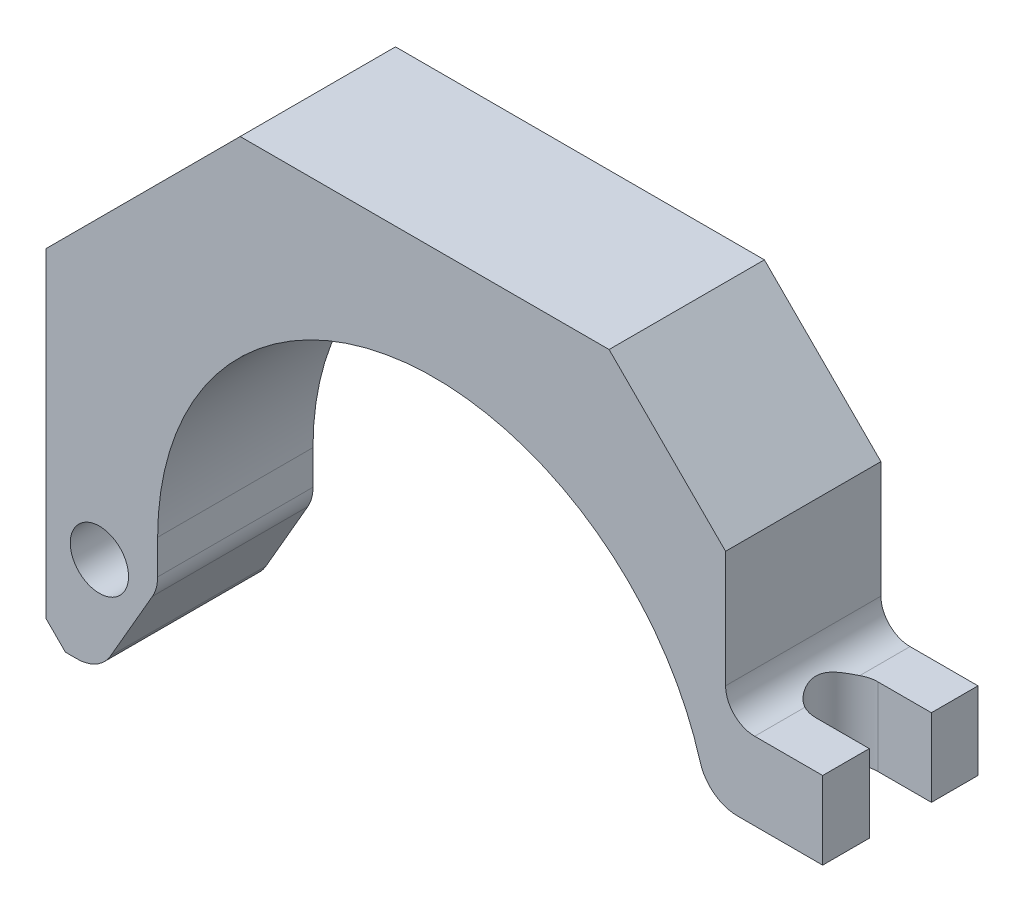
ISO-10303-21;
HEADER;
FILE_DESCRIPTION(('STEP AP214'),'2;1');
FILE_NAME('part.step','',(''),(''),'','','');
FILE_SCHEMA(('AUTOMOTIVE_DESIGN { 1 0 10303 214 1 1 1 1 }'));
ENDSEC;
DATA;
#1=APPLICATION_CONTEXT('core data for automotive mechanical design processes');
#2=APPLICATION_PROTOCOL_DEFINITION('international standard','automotive_design',2000,#1);
#3=PRODUCT_CONTEXT('',#1,'mechanical');
#4=PRODUCT('Part','Part','',(#3));
#5=PRODUCT_RELATED_PRODUCT_CATEGORY('part','',(#4));
#6=PRODUCT_DEFINITION_FORMATION('','',#4);
#7=PRODUCT_DEFINITION_CONTEXT('part definition',#1,'design');
#8=PRODUCT_DEFINITION('design','',#6,#7);
#9=PRODUCT_DEFINITION_SHAPE('','',#8);
#10=(LENGTH_UNIT() NAMED_UNIT(*) SI_UNIT(.MILLI.,.METRE.));
#11=(NAMED_UNIT(*) PLANE_ANGLE_UNIT() SI_UNIT($,.RADIAN.));
#12=(NAMED_UNIT(*) SI_UNIT($,.STERADIAN.) SOLID_ANGLE_UNIT());
#13=UNCERTAINTY_MEASURE_WITH_UNIT(LENGTH_MEASURE(1.E-05),#10,'distance_accuracy_value','');
#14=(GEOMETRIC_REPRESENTATION_CONTEXT(3) GLOBAL_UNCERTAINTY_ASSIGNED_CONTEXT((#13)) GLOBAL_UNIT_ASSIGNED_CONTEXT((#10,
#11,#12)) REPRESENTATION_CONTEXT('',''));
#15=CARTESIAN_POINT('',(0.,0.,0.));
#16=DIRECTION('',(0.,0.,1.));
#17=DIRECTION('',(1.,0.,0.));
#18=AXIS2_PLACEMENT_3D('',#15,#16,#17);
#19=CARTESIAN_POINT('',(40.,20.,16.));
#20=DIRECTION('',(-1.,0.,0.));
#21=DIRECTION('',(0.,0.,1.));
#22=AXIS2_PLACEMENT_3D('',#19,#20,#21);
#23=PLANE('',#22);
#24=DIRECTION('',(0.,0.,-1.));
#25=VECTOR('',#24,1.);
#26=CARTESIAN_POINT('',(40.,-15.,16.));
#27=LINE('',#26,#25);
#28=CARTESIAN_POINT('',(40.,-15.,16.));
#29=VERTEX_POINT('',#28);
#30=CARTESIAN_POINT('',(40.,-15.,11.2));
#31=VERTEX_POINT('',#30);
#32=EDGE_CURVE('E236',#29,#31,#27,.T.);
#33=ORIENTED_EDGE('',*,*,#32,.T.);
#34=DIRECTION('',(0.,1.,0.));
#35=VECTOR('',#34,1.);
#36=CARTESIAN_POINT('',(40.,20.,11.2));
#37=LINE('',#36,#35);
#38=CARTESIAN_POINT('',(40.,-7.,11.2));
#39=VERTEX_POINT('',#38);
#40=EDGE_CURVE('E216',#31,#39,#37,.T.);
#41=ORIENTED_EDGE('',*,*,#40,.T.);
#42=DIRECTION('',(0.,0.,1.));
#43=VECTOR('',#42,1.);
#44=CARTESIAN_POINT('',(40.,-7.,16.));
#45=LINE('',#44,#43);
#46=CARTESIAN_POINT('',(40.,-7.,16.));
#47=VERTEX_POINT('',#46);
#48=EDGE_CURVE('E292',#39,#47,#45,.T.);
#49=ORIENTED_EDGE('',*,*,#48,.T.);
#50=DIRECTION('',(0.,1.,0.));
#51=VECTOR('',#50,1.);
#52=CARTESIAN_POINT('',(40.,20.,16.));
#53=LINE('',#52,#51);
#54=EDGE_CURVE('E246',#29,#47,#53,.T.);
#55=ORIENTED_EDGE('',*,*,#54,.F.);
#56=EDGE_LOOP('',(#33,#41,#49,#55));
#57=FACE_BOUND('',#56,.T.);
#58=ADVANCED_FACE('F36',(#57),#23,.F.);
#59=CARTESIAN_POINT('',(30.,-7.,0.));
#60=DIRECTION('',(0.,-1.,0.));
#61=DIRECTION('',(0.,0.,-1.));
#62=AXIS2_PLACEMENT_3D('',#59,#60,#61);
#63=PLANE('',#62);
#64=DIRECTION('',(-1.,0.,0.));
#65=VECTOR('',#64,1.);
#66=CARTESIAN_POINT('',(30.,-7.,11.2));
#67=LINE('',#66,#65);
#68=CARTESIAN_POINT('',(34.5,-7.,11.2));
#69=VERTEX_POINT('',#68);
#70=EDGE_CURVE('E11',#39,#69,#67,.T.);
#71=ORIENTED_EDGE('',*,*,#70,.T.);
#72=CARTESIAN_POINT('',(34.5,-7.,8.));
#73=DIRECTION('',(0.,-1.,0.));
#74=DIRECTION('',(0.,0.,-1.));
#75=AXIS2_PLACEMENT_3D('',#72,#73,#74);
#76=CIRCLE('',#75,3.2);
#77=CARTESIAN_POINT('',(33.,-7.,10.8266588050205));
#78=VERTEX_POINT('',#77);
#79=EDGE_CURVE('E213',#69,#78,#76,.T.);
#80=ORIENTED_EDGE('',*,*,#79,.T.);
#81=DIRECTION('',(0.,0.,1.));
#82=VECTOR('',#81,1.);
#83=CARTESIAN_POINT('',(33.,-7.,16.));
#84=LINE('',#83,#82);
#85=CARTESIAN_POINT('',(33.,-7.,16.));
#86=VERTEX_POINT('',#85);
#87=EDGE_CURVE('E305',#78,#86,#84,.T.);
#88=ORIENTED_EDGE('',*,*,#87,.T.);
#89=DIRECTION('',(1.,0.,0.));
#90=VECTOR('',#89,1.);
#91=CARTESIAN_POINT('',(30.,-7.,16.));
#92=LINE('',#91,#90);
#93=EDGE_CURVE('E224',#86,#47,#92,.T.);
#94=ORIENTED_EDGE('',*,*,#93,.T.);
#95=ORIENTED_EDGE('',*,*,#48,.F.);
#96=EDGE_LOOP('',(#71,#80,#88,#94,#95));
#97=FACE_BOUND('',#96,.T.);
#98=ADVANCED_FACE('F374',(#97),#63,.F.);
#99=CARTESIAN_POINT('',(0.,-20.,16.));
#100=DIRECTION('',(0.,0.,1.));
#101=DIRECTION('',(1.,0.,0.));
#102=AXIS2_PLACEMENT_3D('',#99,#100,#101);
#103=PLANE('',#102);
#104=DIRECTION('',(0.,-1.,0.));
#105=VECTOR('',#104,1.);
#106=CARTESIAN_POINT('',(-40.,20.,16.));
#107=LINE('',#106,#105);
#108=CARTESIAN_POINT('',(-40.,0.,16.));
#109=VERTEX_POINT('',#108);
#110=CARTESIAN_POINT('',(-40.,-33.,16.));
#111=VERTEX_POINT('',#110);
#112=EDGE_CURVE('E252',#109,#111,#107,.T.);
#113=ORIENTED_EDGE('',*,*,#112,.T.);
#114=DIRECTION('',(-0.707106781186548,0.707106781186548,0.));
#115=VECTOR('',#114,1.);
#116=CARTESIAN_POINT('',(-26.5,-46.5,16.));
#117=LINE('',#116,#115);
#118=CARTESIAN_POINT('',(-38.,-35.,16.));
#119=VERTEX_POINT('',#118);
#120=EDGE_CURVE('E350',#111,#119,#117,.F.);
#121=ORIENTED_EDGE('',*,*,#120,.T.);
#122=DIRECTION('',(1.,0.,0.));
#123=VECTOR('',#122,1.);
#124=CARTESIAN_POINT('',(-40.,-35.,16.));
#125=LINE('',#124,#123);
#126=CARTESIAN_POINT('',(-36.8094010767585,-35.,16.));
#127=VERTEX_POINT('',#126);
#128=EDGE_CURVE('E254',#119,#127,#125,.T.);
#129=ORIENTED_EDGE('',*,*,#128,.T.);
#130=CARTESIAN_POINT('',(-36.8094010767585,-31.,16.));
#131=DIRECTION('',(0.,0.,1.));
#132=DIRECTION('',(1.,0.,0.));
#133=AXIS2_PLACEMENT_3D('',#130,#131,#132);
#134=CIRCLE('',#133,4.);
#135=CARTESIAN_POINT('',(-33.3452994616207,-33.,16.));
#136=VERTEX_POINT('',#135);
#137=EDGE_CURVE('E328',#127,#136,#134,.T.);
#138=ORIENTED_EDGE('',*,*,#137,.T.);
#139=DIRECTION('',(-0.500000000000001,-0.866025403784438,0.));
#140=VECTOR('',#139,1.);
#141=CARTESIAN_POINT('',(-19.3798094716167,-8.81106178471843,16.));
#142=LINE('',#141,#140);
#143=CARTESIAN_POINT('',(-29.0358983848623,-25.5358983848623,16.));
#144=VERTEX_POINT('',#143);
#145=EDGE_CURVE('E279',#136,#144,#142,.F.);
#146=ORIENTED_EDGE('',*,*,#145,.T.);
#147=CARTESIAN_POINT('',(-32.5,-23.5358983848623,16.));
#148=DIRECTION('',(0.,0.,1.));
#149=DIRECTION('',(1.,0.,0.));
#150=AXIS2_PLACEMENT_3D('',#147,#148,#149);
#151=CIRCLE('',#150,4.);
#152=CARTESIAN_POINT('',(-28.5,-23.5358983848623,16.));
#153=VERTEX_POINT('',#152);
#154=EDGE_CURVE('E323',#144,#153,#151,.T.);
#155=ORIENTED_EDGE('',*,*,#154,.T.);
#156=DIRECTION('',(0.,1.,0.));
#157=VECTOR('',#156,1.);
#158=CARTESIAN_POINT('',(-28.5,-35.,16.));
#159=LINE('',#158,#157);
#160=CARTESIAN_POINT('',(-28.5,-20.,16.));
#161=VERTEX_POINT('',#160);
#162=EDGE_CURVE('E256',#153,#161,#159,.T.);
#163=ORIENTED_EDGE('',*,*,#162,.T.);
#164=CARTESIAN_POINT('',(0.,-20.,16.));
#165=DIRECTION('',(0.,0.,-1.));
#166=DIRECTION('',(1.,0.,0.));
#167=AXIS2_PLACEMENT_3D('',#164,#165,#166);
#168=CIRCLE('',#167,28.5);
#169=CARTESIAN_POINT('',(27.3854245775,-12.1076923076923,16.));
#170=VERTEX_POINT('',#169);
#171=EDGE_CURVE('E258',#161,#170,#168,.T.);
#172=ORIENTED_EDGE('',*,*,#171,.T.);
#173=CARTESIAN_POINT('',(31.2289929392544,-11.,16.));
#174=DIRECTION('',(0.,0.,1.));
#175=DIRECTION('',(1.,0.,0.));
#176=AXIS2_PLACEMENT_3D('',#173,#174,#175);
#177=CIRCLE('',#176,4.);
#178=CARTESIAN_POINT('',(31.2289929392544,-15.,16.));
#179=VERTEX_POINT('',#178);
#180=EDGE_CURVE('E338',#170,#179,#177,.T.);
#181=ORIENTED_EDGE('',*,*,#180,.T.);
#182=DIRECTION('',(-1.,0.,0.));
#183=VECTOR('',#182,1.);
#184=CARTESIAN_POINT('',(-17.5120876663421,-15.,16.));
#185=LINE('',#184,#183);
#186=EDGE_CURVE('E226',#29,#179,#185,.T.);
#187=ORIENTED_EDGE('',*,*,#186,.F.);
#188=ORIENTED_EDGE('',*,*,#54,.T.);
#189=ORIENTED_EDGE('',*,*,#93,.F.);
#190=CARTESIAN_POINT('',(33.,-4.,16.));
#191=DIRECTION('',(0.,0.,1.));
#192=DIRECTION('',(1.,0.,0.));
#193=AXIS2_PLACEMENT_3D('',#190,#191,#192);
#194=CIRCLE('',#193,3.);
#195=CARTESIAN_POINT('',(30.,-4.,16.));
#196=VERTEX_POINT('',#195);
#197=EDGE_CURVE('E311',#86,#196,#194,.F.);
#198=ORIENTED_EDGE('',*,*,#197,.T.);
#199=DIRECTION('',(0.,-1.,0.));
#200=VECTOR('',#199,1.);
#201=CARTESIAN_POINT('',(30.,22.6403912651916,16.));
#202=LINE('',#201,#200);
#203=CARTESIAN_POINT('',(30.,7.99999999999994,16.));
#204=VERTEX_POINT('',#203);
#205=EDGE_CURVE('E219',#204,#196,#202,.T.);
#206=ORIENTED_EDGE('',*,*,#205,.F.);
#207=DIRECTION('',(0.707106781186546,-0.707106781186549,0.));
#208=VECTOR('',#207,1.);
#209=CARTESIAN_POINT('',(29.,8.9999999999999,16.));
#210=LINE('',#209,#208);
#211=CARTESIAN_POINT('',(18.,20.,16.));
#212=VERTEX_POINT('',#211);
#213=EDGE_CURVE('E303',#204,#212,#210,.F.);
#214=ORIENTED_EDGE('',*,*,#213,.T.);
#215=DIRECTION('',(-1.,0.,0.));
#216=VECTOR('',#215,1.);
#217=CARTESIAN_POINT('',(-40.,20.,16.));
#218=LINE('',#217,#216);
#219=CARTESIAN_POINT('',(-19.9999999999999,20.,16.));
#220=VERTEX_POINT('',#219);
#221=EDGE_CURVE('E249',#212,#220,#218,.T.);
#222=ORIENTED_EDGE('',*,*,#221,.T.);
#223=DIRECTION('',(0.707106781186548,0.707106781186547,0.));
#224=VECTOR('',#223,1.);
#225=CARTESIAN_POINT('',(-30.,10.,16.));
#226=LINE('',#225,#224);
#227=EDGE_CURVE('E290',#220,#109,#226,.F.);
#228=ORIENTED_EDGE('',*,*,#227,.T.);
#229=EDGE_LOOP('',(#113,#121,#129,#138,#146,#155,#163,#172,#181,#187,#188,#189,#198,#206,#214,
#222,#228));
#230=FACE_BOUND('',#229,.T.);
#231=CARTESIAN_POINT('',(-34.5,-25.,16.));
#232=DIRECTION('',(0.,0.,1.));
#233=DIRECTION('',(1.,0.,0.));
#234=AXIS2_PLACEMENT_3D('',#231,#232,#233);
#235=CIRCLE('',#234,3.);
#236=CARTESIAN_POINT('',(-31.5,-25.,16.));
#237=VERTEX_POINT('',#236);
#238=EDGE_CURVE('E240',#237,#237,#235,.T.);
#239=ORIENTED_EDGE('',*,*,#238,.F.);
#240=EDGE_LOOP('',(#239));
#241=FACE_BOUND('',#240,.T.);
#242=ADVANCED_FACE('F387',(#230,#241),#103,.T.);
#243=CARTESIAN_POINT('',(0.,-20.,0.));
#244=DIRECTION('',(0.,0.,1.));
#245=DIRECTION('',(1.,0.,0.));
#246=AXIS2_PLACEMENT_3D('',#243,#244,#245);
#247=PLANE('',#246);
#248=DIRECTION('',(1.,0.,0.));
#249=VECTOR('',#248,1.);
#250=CARTESIAN_POINT('',(-40.,-35.,0.));
#251=LINE('',#250,#249);
#252=CARTESIAN_POINT('',(-38.,-35.,0.));
#253=VERTEX_POINT('',#252);
#254=CARTESIAN_POINT('',(-36.8094010767585,-35.,0.));
#255=VERTEX_POINT('',#254);
#256=EDGE_CURVE('E268',#253,#255,#251,.T.);
#257=ORIENTED_EDGE('',*,*,#256,.F.);
#258=DIRECTION('',(0.707106781186548,-0.707106781186548,0.));
#259=VECTOR('',#258,1.);
#260=CARTESIAN_POINT('',(-38.,-35.,0.));
#261=LINE('',#260,#259);
#262=CARTESIAN_POINT('',(-40.,-33.,0.));
#263=VERTEX_POINT('',#262);
#264=EDGE_CURVE('E347',#253,#263,#261,.F.);
#265=ORIENTED_EDGE('',*,*,#264,.T.);
#266=DIRECTION('',(0.,-1.,0.));
#267=VECTOR('',#266,1.);
#268=CARTESIAN_POINT('',(-40.,-20.,0.));
#269=LINE('',#268,#267);
#270=CARTESIAN_POINT('',(-40.,0.,0.));
#271=VERTEX_POINT('',#270);
#272=EDGE_CURVE('E266',#271,#263,#269,.T.);
#273=ORIENTED_EDGE('',*,*,#272,.F.);
#274=DIRECTION('',(-0.707106781186548,-0.707106781186547,0.));
#275=VECTOR('',#274,1.);
#276=CARTESIAN_POINT('',(-40.,0.,0.));
#277=LINE('',#276,#275);
#278=CARTESIAN_POINT('',(-19.9999999999999,20.,0.));
#279=VERTEX_POINT('',#278);
#280=EDGE_CURVE('E284',#271,#279,#277,.F.);
#281=ORIENTED_EDGE('',*,*,#280,.T.);
#282=DIRECTION('',(-1.,0.,0.));
#283=VECTOR('',#282,1.);
#284=CARTESIAN_POINT('',(-40.,20.,0.));
#285=LINE('',#284,#283);
#286=CARTESIAN_POINT('',(18.,20.,0.));
#287=VERTEX_POINT('',#286);
#288=EDGE_CURVE('E264',#287,#279,#285,.T.);
#289=ORIENTED_EDGE('',*,*,#288,.F.);
#290=DIRECTION('',(-0.707106781186546,0.707106781186549,0.));
#291=VECTOR('',#290,1.);
#292=CARTESIAN_POINT('',(18.,20.,0.));
#293=LINE('',#292,#291);
#294=CARTESIAN_POINT('',(30.,7.99999999999995,0.));
#295=VERTEX_POINT('',#294);
#296=EDGE_CURVE('E299',#287,#295,#293,.F.);
#297=ORIENTED_EDGE('',*,*,#296,.T.);
#298=DIRECTION('',(0.,-1.,0.));
#299=VECTOR('',#298,1.);
#300=CARTESIAN_POINT('',(30.,22.6403912651916,0.));
#301=LINE('',#300,#299);
#302=CARTESIAN_POINT('',(30.,-4.,0.));
#303=VERTEX_POINT('',#302);
#304=EDGE_CURVE('E220',#295,#303,#301,.T.);
#305=ORIENTED_EDGE('',*,*,#304,.T.);
#306=CARTESIAN_POINT('',(33.,-4.,0.));
#307=DIRECTION('',(0.,0.,1.));
#308=DIRECTION('',(1.,0.,0.));
#309=AXIS2_PLACEMENT_3D('',#306,#307,#308);
#310=CIRCLE('',#309,3.);
#311=CARTESIAN_POINT('',(33.,-7.,0.));
#312=VERTEX_POINT('',#311);
#313=EDGE_CURVE('E313',#303,#312,#310,.T.);
#314=ORIENTED_EDGE('',*,*,#313,.T.);
#315=DIRECTION('',(1.,0.,0.));
#316=VECTOR('',#315,1.);
#317=CARTESIAN_POINT('',(30.,-7.,0.));
#318=LINE('',#317,#316);
#319=CARTESIAN_POINT('',(40.,-7.,0.));
#320=VERTEX_POINT('',#319);
#321=EDGE_CURVE('E223',#312,#320,#318,.T.);
#322=ORIENTED_EDGE('',*,*,#321,.T.);
#323=DIRECTION('',(0.,1.,0.));
#324=VECTOR('',#323,1.);
#325=CARTESIAN_POINT('',(40.,20.,0.));
#326=LINE('',#325,#324);
#327=CARTESIAN_POINT('',(40.,-15.,0.));
#328=VERTEX_POINT('',#327);
#329=EDGE_CURVE('E243',#328,#320,#326,.T.);
#330=ORIENTED_EDGE('',*,*,#329,.F.);
#331=DIRECTION('',(-1.,0.,0.));
#332=VECTOR('',#331,1.);
#333=CARTESIAN_POINT('',(-17.5120876663421,-15.,0.));
#334=LINE('',#333,#332);
#335=CARTESIAN_POINT('',(31.2289929392544,-15.,0.));
#336=VERTEX_POINT('',#335);
#337=EDGE_CURVE('E231',#328,#336,#334,.T.);
#338=ORIENTED_EDGE('',*,*,#337,.T.);
#339=CARTESIAN_POINT('',(31.2289929392544,-11.,0.));
#340=DIRECTION('',(0.,0.,1.));
#341=DIRECTION('',(1.,0.,0.));
#342=AXIS2_PLACEMENT_3D('',#339,#340,#341);
#343=CIRCLE('',#342,4.);
#344=CARTESIAN_POINT('',(27.3854245775,-12.1076923076923,0.));
#345=VERTEX_POINT('',#344);
#346=EDGE_CURVE('E342',#336,#345,#343,.F.);
#347=ORIENTED_EDGE('',*,*,#346,.T.);
#348=CARTESIAN_POINT('',(0.,-20.,0.));
#349=DIRECTION('',(0.,0.,-1.));
#350=DIRECTION('',(1.,0.,0.));
#351=AXIS2_PLACEMENT_3D('',#348,#349,#350);
#352=CIRCLE('',#351,28.5);
#353=CARTESIAN_POINT('',(-28.5,-20.,0.));
#354=VERTEX_POINT('',#353);
#355=EDGE_CURVE('E250',#354,#345,#352,.T.);
#356=ORIENTED_EDGE('',*,*,#355,.F.);
#357=DIRECTION('',(0.,1.,0.));
#358=VECTOR('',#357,1.);
#359=CARTESIAN_POINT('',(-28.5,-35.,0.));
#360=LINE('',#359,#358);
#361=CARTESIAN_POINT('',(-28.5,-23.5358983848623,0.));
#362=VERTEX_POINT('',#361);
#363=EDGE_CURVE('E270',#362,#354,#360,.T.);
#364=ORIENTED_EDGE('',*,*,#363,.F.);
#365=CARTESIAN_POINT('',(-32.5,-23.5358983848623,0.));
#366=DIRECTION('',(0.,0.,1.));
#367=DIRECTION('',(1.,0.,0.));
#368=AXIS2_PLACEMENT_3D('',#365,#366,#367);
#369=CIRCLE('',#368,4.);
#370=CARTESIAN_POINT('',(-29.0358983848623,-25.5358983848623,0.));
#371=VERTEX_POINT('',#370);
#372=EDGE_CURVE('E318',#362,#371,#369,.F.);
#373=ORIENTED_EDGE('',*,*,#372,.T.);
#374=DIRECTION('',(0.500000000000001,0.866025403784438,0.));
#375=VECTOR('',#374,1.);
#376=CARTESIAN_POINT('',(-28.5,-24.6076951545868,0.));
#377=LINE('',#376,#375);
#378=CARTESIAN_POINT('',(-33.3452994616207,-33.,0.));
#379=VERTEX_POINT('',#378);
#380=EDGE_CURVE('E276',#371,#379,#377,.F.);
#381=ORIENTED_EDGE('',*,*,#380,.T.);
#382=CARTESIAN_POINT('',(-36.8094010767585,-31.,0.));
#383=DIRECTION('',(0.,0.,1.));
#384=DIRECTION('',(1.,0.,0.));
#385=AXIS2_PLACEMENT_3D('',#382,#383,#384);
#386=CIRCLE('',#385,4.);
#387=EDGE_CURVE('E332',#379,#255,#386,.F.);
#388=ORIENTED_EDGE('',*,*,#387,.T.);
#389=EDGE_LOOP('',(#257,#265,#273,#281,#289,#297,#305,#314,#322,#330,#338,#347,#356,#364,#373,
#381,#388));
#390=FACE_BOUND('',#389,.T.);
#391=CARTESIAN_POINT('',(-34.5,-25.,0.));
#392=DIRECTION('',(0.,0.,1.));
#393=DIRECTION('',(1.,0.,0.));
#394=AXIS2_PLACEMENT_3D('',#391,#392,#393);
#395=CIRCLE('',#394,3.);
#396=CARTESIAN_POINT('',(-31.5,-25.,0.));
#397=VERTEX_POINT('',#396);
#398=EDGE_CURVE('E239',#397,#397,#395,.T.);
#399=ORIENTED_EDGE('',*,*,#398,.T.);
#400=EDGE_LOOP('',(#399));
#401=FACE_BOUND('',#400,.T.);
#402=ADVANCED_FACE('F390',(#390,#401),#247,.F.);
#403=CARTESIAN_POINT('',(40.,-7.,4.8));
#404=VERTEX_POINT('',#403);
#405=EDGE_CURVE('E293',#320,#404,#45,.T.);
#406=ORIENTED_EDGE('',*,*,#405,.T.);
#407=DIRECTION('',(0.,-1.,0.));
#408=VECTOR('',#407,1.);
#409=CARTESIAN_POINT('',(40.,20.,4.8));
#410=LINE('',#409,#408);
#411=CARTESIAN_POINT('',(40.,-15.,4.8));
#412=VERTEX_POINT('',#411);
#413=EDGE_CURVE('E214',#404,#412,#410,.T.);
#414=ORIENTED_EDGE('',*,*,#413,.T.);
#415=EDGE_CURVE('E207',#412,#328,#27,.T.);
#416=ORIENTED_EDGE('',*,*,#415,.T.);
#417=ORIENTED_EDGE('',*,*,#329,.T.);
#418=EDGE_LOOP('',(#406,#414,#416,#417));
#419=FACE_BOUND('',#418,.T.);
#420=ADVANCED_FACE('F394',(#419),#23,.F.);
#421=CARTESIAN_POINT('',(-40.,20.,16.));
#422=DIRECTION('',(0.,-1.,0.));
#423=DIRECTION('',(0.,0.,-1.));
#424=AXIS2_PLACEMENT_3D('',#421,#422,#423);
#425=PLANE('',#424);
#426=ORIENTED_EDGE('',*,*,#221,.F.);
#427=DIRECTION('',(0.,0.,-1.));
#428=VECTOR('',#427,1.);
#429=CARTESIAN_POINT('',(18.,20.,16.));
#430=LINE('',#429,#428);
#431=EDGE_CURVE('E296',#212,#287,#430,.T.);
#432=ORIENTED_EDGE('',*,*,#431,.T.);
#433=ORIENTED_EDGE('',*,*,#288,.T.);
#434=DIRECTION('',(0.,0.,1.));
#435=VECTOR('',#434,1.);
#436=CARTESIAN_POINT('',(-19.9999999999999,20.,16.));
#437=LINE('',#436,#435);
#438=EDGE_CURVE('E287',#279,#220,#437,.T.);
#439=ORIENTED_EDGE('',*,*,#438,.T.);
#440=EDGE_LOOP('',(#426,#432,#433,#439));
#441=FACE_BOUND('',#440,.T.);
#442=ADVANCED_FACE('F410',(#441),#425,.F.);
#443=CARTESIAN_POINT('',(-40.,-20.,16.));
#444=DIRECTION('',(1.,0.,0.));
#445=DIRECTION('',(0.,0.,-1.));
#446=AXIS2_PLACEMENT_3D('',#443,#444,#445);
#447=PLANE('',#446);
#448=ORIENTED_EDGE('',*,*,#272,.T.);
#449=DIRECTION('',(0.,0.,1.));
#450=VECTOR('',#449,1.);
#451=CARTESIAN_POINT('',(-40.,-33.,16.));
#452=LINE('',#451,#450);
#453=EDGE_CURVE('E59',#263,#111,#452,.T.);
#454=ORIENTED_EDGE('',*,*,#453,.T.);
#455=ORIENTED_EDGE('',*,*,#112,.F.);
#456=DIRECTION('',(0.,0.,-1.));
#457=VECTOR('',#456,1.);
#458=CARTESIAN_POINT('',(-40.,0.,16.));
#459=LINE('',#458,#457);
#460=EDGE_CURVE('E281',#109,#271,#459,.T.);
#461=ORIENTED_EDGE('',*,*,#460,.T.);
#462=EDGE_LOOP('',(#448,#454,#455,#461));
#463=FACE_BOUND('',#462,.T.);
#464=ADVANCED_FACE('F406',(#463),#447,.F.);
#465=CARTESIAN_POINT('',(-40.,-35.,16.));
#466=DIRECTION('',(0.,1.,0.));
#467=DIRECTION('',(0.,0.,1.));
#468=AXIS2_PLACEMENT_3D('',#465,#466,#467);
#469=PLANE('',#468);
#470=ORIENTED_EDGE('',*,*,#128,.F.);
#471=DIRECTION('',(0.,0.,-1.));
#472=VECTOR('',#471,1.);
#473=CARTESIAN_POINT('',(-38.,-35.,16.));
#474=LINE('',#473,#472);
#475=EDGE_CURVE('E344',#119,#253,#474,.T.);
#476=ORIENTED_EDGE('',*,*,#475,.T.);
#477=ORIENTED_EDGE('',*,*,#256,.T.);
#478=DIRECTION('',(0.,0.,-1.));
#479=VECTOR('',#478,1.);
#480=CARTESIAN_POINT('',(-36.8094010767585,-35.,16.));
#481=LINE('',#480,#479);
#482=EDGE_CURVE('E325',#255,#127,#481,.F.);
#483=ORIENTED_EDGE('',*,*,#482,.T.);
#484=EDGE_LOOP('',(#470,#476,#477,#483));
#485=FACE_BOUND('',#484,.T.);
#486=ADVANCED_FACE('F402',(#485),#469,.F.);
#487=CARTESIAN_POINT('',(-28.5,-35.,16.));
#488=DIRECTION('',(-1.,0.,0.));
#489=DIRECTION('',(0.,-1.,0.));
#490=AXIS2_PLACEMENT_3D('',#487,#488,#489);
#491=PLANE('',#490);
#492=ORIENTED_EDGE('',*,*,#162,.F.);
#493=DIRECTION('',(0.,0.,1.));
#494=VECTOR('',#493,1.);
#495=CARTESIAN_POINT('',(-28.5,-23.5358983848623,0.));
#496=LINE('',#495,#494);
#497=EDGE_CURVE('E315',#153,#362,#496,.F.);
#498=ORIENTED_EDGE('',*,*,#497,.T.);
#499=ORIENTED_EDGE('',*,*,#363,.T.);
#500=DIRECTION('',(0.,0.,-1.));
#501=VECTOR('',#500,1.);
#502=CARTESIAN_POINT('',(-28.5,-20.,16.));
#503=LINE('',#502,#501);
#504=EDGE_CURVE('E261',#161,#354,#503,.T.);
#505=ORIENTED_EDGE('',*,*,#504,.F.);
#506=EDGE_LOOP('',(#492,#498,#499,#505));
#507=FACE_BOUND('',#506,.T.);
#508=ADVANCED_FACE('F398',(#507),#491,.F.);
#509=CARTESIAN_POINT('',(0.,-20.,16.));
#510=DIRECTION('',(0.,0.,-1.));
#511=DIRECTION('',(-1.,0.,0.));
#512=AXIS2_PLACEMENT_3D('',#509,#510,#511);
#513=CYLINDRICAL_SURFACE('',#512,28.5);
#514=ORIENTED_EDGE('',*,*,#355,.T.);
#515=DIRECTION('',(0.,0.,-1.));
#516=VECTOR('',#515,1.);
#517=CARTESIAN_POINT('',(27.3854245775,-12.1076923076923,16.));
#518=LINE('',#517,#516);
#519=EDGE_CURVE('E335',#345,#170,#518,.F.);
#520=ORIENTED_EDGE('',*,*,#519,.T.);
#521=ORIENTED_EDGE('',*,*,#171,.F.);
#522=ORIENTED_EDGE('',*,*,#504,.T.);
#523=EDGE_LOOP('',(#514,#520,#521,#522));
#524=FACE_BOUND('',#523,.T.);
#525=ADVANCED_FACE('F385',(#524),#513,.F.);
#526=CARTESIAN_POINT('',(-34.5,-25.,16.));
#527=DIRECTION('',(0.,0.,-1.));
#528=DIRECTION('',(-1.,0.,0.));
#529=AXIS2_PLACEMENT_3D('',#526,#527,#528);
#530=CYLINDRICAL_SURFACE('',#529,3.);
#531=ORIENTED_EDGE('',*,*,#238,.T.);
#532=EDGE_LOOP('',(#531));
#533=FACE_BOUND('',#532,.T.);
#534=ORIENTED_EDGE('',*,*,#398,.F.);
#535=EDGE_LOOP('',(#534));
#536=FACE_BOUND('',#535,.T.);
#537=ADVANCED_FACE('F382',(#533,#536),#530,.F.);
#538=CARTESIAN_POINT('',(-28.5,-24.6076951545868,16.));
#539=DIRECTION('',(-0.866025403784438,0.500000000000001,0.));
#540=DIRECTION('',(0.,0.,-1.));
#541=AXIS2_PLACEMENT_3D('',#538,#539,#540);
#542=PLANE('',#541);
#543=ORIENTED_EDGE('',*,*,#145,.F.);
#544=DIRECTION('',(0.,0.,1.));
#545=VECTOR('',#544,1.);
#546=CARTESIAN_POINT('',(-33.3452994616207,-33.,0.));
#547=LINE('',#546,#545);
#548=EDGE_CURVE('E330',#136,#379,#547,.F.);
#549=ORIENTED_EDGE('',*,*,#548,.T.);
#550=ORIENTED_EDGE('',*,*,#380,.F.);
#551=DIRECTION('',(0.,0.,-1.));
#552=VECTOR('',#551,1.);
#553=CARTESIAN_POINT('',(-29.0358983848623,-25.5358983848623,16.));
#554=LINE('',#553,#552);
#555=EDGE_CURVE('E320',#371,#144,#554,.F.);
#556=ORIENTED_EDGE('',*,*,#555,.T.);
#557=EDGE_LOOP('',(#543,#549,#550,#556));
#558=FACE_BOUND('',#557,.T.);
#559=ADVANCED_FACE('F381',(#558),#542,.F.);
#560=CARTESIAN_POINT('',(-17.5120876663421,-15.,0.));
#561=DIRECTION('',(0.,1.,0.));
#562=DIRECTION('',(0.,0.,1.));
#563=AXIS2_PLACEMENT_3D('',#560,#561,#562);
#564=PLANE('',#563);
#565=CARTESIAN_POINT('',(34.5,-15.,8.));
#566=DIRECTION('',(0.,-1.,0.));
#567=DIRECTION('',(0.,0.,-1.));
#568=AXIS2_PLACEMENT_3D('',#565,#566,#567);
#569=CIRCLE('',#568,3.2);
#570=CARTESIAN_POINT('',(34.5,-15.,11.2));
#571=VERTEX_POINT('',#570);
#572=CARTESIAN_POINT('',(34.5,-15.,4.8));
#573=VERTEX_POINT('',#572);
#574=EDGE_CURVE('E198',#571,#573,#569,.T.);
#575=ORIENTED_EDGE('',*,*,#574,.F.);
#576=DIRECTION('',(-1.,0.,0.));
#577=VECTOR('',#576,1.);
#578=CARTESIAN_POINT('',(34.5,-15.,11.2));
#579=LINE('',#578,#577);
#580=EDGE_CURVE('E194',#31,#571,#579,.T.);
#581=ORIENTED_EDGE('',*,*,#580,.F.);
#582=ORIENTED_EDGE('',*,*,#32,.F.);
#583=ORIENTED_EDGE('',*,*,#186,.T.);
#584=DIRECTION('',(0.,0.,-1.));
#585=VECTOR('',#584,1.);
#586=CARTESIAN_POINT('',(31.2289929392544,-15.,0.));
#587=LINE('',#586,#585);
#588=EDGE_CURVE('E340',#179,#336,#587,.T.);
#589=ORIENTED_EDGE('',*,*,#588,.T.);
#590=ORIENTED_EDGE('',*,*,#337,.F.);
#591=ORIENTED_EDGE('',*,*,#415,.F.);
#592=DIRECTION('',(1.,0.,0.));
#593=VECTOR('',#592,1.);
#594=CARTESIAN_POINT('',(34.5,-15.,4.8));
#595=LINE('',#594,#593);
#596=EDGE_CURVE('E190',#573,#412,#595,.T.);
#597=ORIENTED_EDGE('',*,*,#596,.F.);
#598=EDGE_LOOP('',(#575,#581,#582,#583,#589,#590,#591,#597));
#599=FACE_BOUND('',#598,.T.);
#600=ADVANCED_FACE('F205',(#599),#564,.F.);
#601=CARTESIAN_POINT('',(-40.,0.,16.));
#602=DIRECTION('',(0.707106781186547,-0.707106781186548,0.));
#603=DIRECTION('',(0.,0.,-1.));
#604=AXIS2_PLACEMENT_3D('',#601,#602,#603);
#605=PLANE('',#604);
#606=ORIENTED_EDGE('',*,*,#227,.F.);
#607=ORIENTED_EDGE('',*,*,#438,.F.);
#608=ORIENTED_EDGE('',*,*,#280,.F.);
#609=ORIENTED_EDGE('',*,*,#460,.F.);
#610=EDGE_LOOP('',(#606,#607,#608,#609));
#611=FACE_BOUND('',#610,.T.);
#612=ADVANCED_FACE('F372',(#611),#605,.F.);
#613=CARTESIAN_POINT('',(33.,-7.,5.17334119497949));
#614=VERTEX_POINT('',#613);
#615=EDGE_CURVE('E306',#312,#614,#84,.T.);
#616=ORIENTED_EDGE('',*,*,#615,.T.);
#617=CARTESIAN_POINT('',(34.5,-7.,4.8));
#618=VERTEX_POINT('',#617);
#619=EDGE_CURVE('E51',#614,#618,#76,.T.);
#620=ORIENTED_EDGE('',*,*,#619,.T.);
#621=DIRECTION('',(1.,0.,0.));
#622=VECTOR('',#621,1.);
#623=CARTESIAN_POINT('',(30.,-7.,4.8));
#624=LINE('',#623,#622);
#625=EDGE_CURVE('E44',#618,#404,#624,.T.);
#626=ORIENTED_EDGE('',*,*,#625,.T.);
#627=ORIENTED_EDGE('',*,*,#405,.F.);
#628=ORIENTED_EDGE('',*,*,#321,.F.);
#629=EDGE_LOOP('',(#616,#620,#626,#627,#628));
#630=FACE_BOUND('',#629,.T.);
#631=ADVANCED_FACE('F368',(#630),#63,.F.);
#632=CARTESIAN_POINT('',(30.,22.6403912651916,0.));
#633=DIRECTION('',(-1.,0.,0.));
#634=DIRECTION('',(0.,-1.,0.));
#635=AXIS2_PLACEMENT_3D('',#632,#633,#634);
#636=PLANE('',#635);
#637=ORIENTED_EDGE('',*,*,#205,.T.);
#638=DIRECTION('',(0.,0.,1.));
#639=VECTOR('',#638,1.);
#640=CARTESIAN_POINT('',(30.,-4.,0.));
#641=LINE('',#640,#639);
#642=EDGE_CURVE('E309',#196,#303,#641,.F.);
#643=ORIENTED_EDGE('',*,*,#642,.T.);
#644=ORIENTED_EDGE('',*,*,#304,.F.);
#645=DIRECTION('',(0.,0.,1.));
#646=VECTOR('',#645,1.);
#647=CARTESIAN_POINT('',(30.,7.99999999999995,0.));
#648=LINE('',#647,#646);
#649=EDGE_CURVE('E301',#295,#204,#648,.T.);
#650=ORIENTED_EDGE('',*,*,#649,.T.);
#651=EDGE_LOOP('',(#637,#643,#644,#650));
#652=FACE_BOUND('',#651,.T.);
#653=ADVANCED_FACE('F371',(#652),#636,.F.);
#654=CARTESIAN_POINT('',(18.,20.,16.));
#655=DIRECTION('',(-0.707106781186549,-0.707106781186546,0.));
#656=DIRECTION('',(0.,0.,-1.));
#657=AXIS2_PLACEMENT_3D('',#654,#655,#656);
#658=PLANE('',#657);
#659=ORIENTED_EDGE('',*,*,#213,.F.);
#660=ORIENTED_EDGE('',*,*,#649,.F.);
#661=ORIENTED_EDGE('',*,*,#296,.F.);
#662=ORIENTED_EDGE('',*,*,#431,.F.);
#663=EDGE_LOOP('',(#659,#660,#661,#662));
#664=FACE_BOUND('',#663,.T.);
#665=ADVANCED_FACE('F377',(#664),#658,.F.);
#666=CARTESIAN_POINT('',(33.,-4.,0.));
#667=DIRECTION('',(0.,0.,-1.));
#668=DIRECTION('',(-1.,0.,0.));
#669=AXIS2_PLACEMENT_3D('',#666,#667,#668);
#670=CYLINDRICAL_SURFACE('',#669,3.);
#671=ORIENTED_EDGE('',*,*,#87,.F.);
#672=CARTESIAN_POINT('',(33.,-7.,10.8266588050205));
#673=CARTESIAN_POINT('',(32.9265135890163,-7.00001014170531,10.7876815719045));
#674=CARTESIAN_POINT('',(32.8546113921696,-6.99730096967713,10.7458356710807));
#675=CARTESIAN_POINT('',(32.7145985051959,-6.98721404430086,10.6569117198894));
#676=CARTESIAN_POINT('',(32.6464825252087,-6.97984299217751,10.6098412595139));
#677=CARTESIAN_POINT('',(32.5149665155707,-6.96127074719993,10.5112452275088));
#678=CARTESIAN_POINT('',(32.4515338335925,-6.95009989095594,10.4597572866904));
#679=CARTESIAN_POINT('',(32.329119424807,-6.92469317151401,10.3524265292215));
#680=CARTESIAN_POINT('',(32.2701392873253,-6.91045622080157,10.2965821718854));
#681=CARTESIAN_POINT('',(32.1008874562184,-6.86447200859117,10.1237097798088));
#682=CARTESIAN_POINT('',(31.9974992269793,-6.82931966281458,10.0007341707166));
#683=CARTESIAN_POINT('',(31.8103336579906,-6.7558753694565,9.74111048443212));
#684=CARTESIAN_POINT('',(31.7266203621221,-6.7175737019994,9.60441976823081));
#685=CARTESIAN_POINT('',(31.5701596363713,-6.63898586884261,9.29966984564883));
#686=CARTESIAN_POINT('',(31.5004747834961,-6.59914396121965,9.1298767496021));
#687=CARTESIAN_POINT('',(31.4182387512912,-6.54932351376701,8.86671770273264));
#688=CARTESIAN_POINT('',(31.3945497492428,-6.53437996286006,8.77764434857951));
#689=CARTESIAN_POINT('',(31.3548591176158,-6.50879932075666,8.59716854492427));
#690=CARTESIAN_POINT('',(31.3388559553521,-6.49816137101782,8.50576656362096));
#691=CARTESIAN_POINT('',(31.3157457425599,-6.4826328893418,8.32848145647363));
#692=CARTESIAN_POINT('',(31.3080548706827,-6.47736690187811,8.2427070313131));
#693=CARTESIAN_POINT('',(31.2996213137015,-6.47158643565716,8.07065575612339));
#694=CARTESIAN_POINT('',(31.2988782349796,-6.47107168772473,7.98437893483391));
#695=CARTESIAN_POINT('',(31.304357026396,-6.47483463068306,7.8121490066044));
#696=CARTESIAN_POINT('',(31.3105790897576,-6.47911245452671,7.7261959087113));
#697=CARTESIAN_POINT('',(31.3298659977537,-6.49214400608649,7.55543001399511));
#698=CARTESIAN_POINT('',(31.3429307794222,-6.50089769261617,7.47061720668653));
#699=CARTESIAN_POINT('',(31.3879004079868,-6.53028214644489,7.24037797050344));
#700=CARTESIAN_POINT('',(31.4265910265476,-6.55490512648604,7.09673612084392));
#701=CARTESIAN_POINT('',(31.5228264904063,-6.61171334500428,6.81749021509183));
#702=CARTESIAN_POINT('',(31.5803934934128,-6.64390745810081,6.68189582734954));
#703=CARTESIAN_POINT('',(31.723525931181,-6.7162497611193,6.40002449630077));
#704=CARTESIAN_POINT('',(31.81205375874,-6.75685622146457,6.25536706050767));
#705=CARTESIAN_POINT('',(32.0112889339033,-6.83440151791079,5.98136050483722));
#706=CARTESIAN_POINT('',(32.1219543139813,-6.8713470989331,5.85198314471573));
#707=CARTESIAN_POINT('',(32.2979182153072,-6.91724619995919,5.67688224878326));
#708=CARTESIAN_POINT('',(32.3550954098258,-6.93048556527446,5.62397730791064));
#709=CARTESIAN_POINT('',(32.4735039449887,-6.95405524362589,5.52221834284703));
#710=CARTESIAN_POINT('',(32.5347337745634,-6.96438663346936,5.47336282391792));
#711=CARTESIAN_POINT('',(32.6613261273277,-6.98150946392808,5.37978961145272));
#712=CARTESIAN_POINT('',(32.7267107873946,-6.98827978218398,5.33509787346544));
#713=CARTESIAN_POINT('',(32.8609126973179,-6.99753224799014,5.2505058909739));
#714=CARTESIAN_POINT('',(32.9297343777453,-7.00000870555277,5.2106120694135));
#715=CARTESIAN_POINT('',(33.,-7.,5.17334119497949));
#716=B_SPLINE_CURVE_WITH_KNOTS('',3,(#672,#673,#674,#675,#676,#677,#678,#679,#680,#681,#682,
#683,#684,#685,#686,#687,#688,#689,#690,#691,#692,#693,#694,#695,#696,#697,#698,#699,#700,#701,
#702,#703,#704,#705,#706,#707,#708,#709,#710,#711,#712,#713,#714,#715),.UNSPECIFIED.,.F.,.F.,(4,
2,2,2,2,2,2,2,2,2,2,2,2,2,2,2,2,2,2,2,2,4),(0.,0.249361242367938,0.498364852290193,
0.745425409899393,0.992573742282987,1.4838531620361,1.97671025758037,2.53692929920182,
2.81669182478163,3.09639853784054,3.35484100067816,3.61326882171023,3.87170381208171,
4.13013642440182,4.58058318209252,5.03156059295042,5.55269275103898,6.07284617292731,
6.30968276359729,6.54643153925918,6.78456918117526,7.02302214948369),.UNSPECIFIED.);
#717=EDGE_CURVE('E352',#78,#614,#716,.T.);
#718=ORIENTED_EDGE('',*,*,#717,.T.);
#719=ORIENTED_EDGE('',*,*,#615,.F.);
#720=ORIENTED_EDGE('',*,*,#313,.F.);
#721=ORIENTED_EDGE('',*,*,#642,.F.);
#722=ORIENTED_EDGE('',*,*,#197,.F.);
#723=EDGE_LOOP('',(#671,#718,#719,#720,#721,#722));
#724=FACE_BOUND('',#723,.T.);
#725=ADVANCED_FACE('F359',(#724),#670,.F.);
#726=CARTESIAN_POINT('',(-32.5,-23.5358983848623,16.));
#727=DIRECTION('',(0.,0.,-1.));
#728=DIRECTION('',(-1.,0.,0.));
#729=AXIS2_PLACEMENT_3D('',#726,#727,#728);
#730=CYLINDRICAL_SURFACE('',#729,4.);
#731=ORIENTED_EDGE('',*,*,#154,.F.);
#732=ORIENTED_EDGE('',*,*,#555,.F.);
#733=ORIENTED_EDGE('',*,*,#372,.F.);
#734=ORIENTED_EDGE('',*,*,#497,.F.);
#735=EDGE_LOOP('',(#731,#732,#733,#734));
#736=FACE_BOUND('',#735,.T.);
#737=ADVANCED_FACE('F427',(#736),#730,.T.);
#738=CARTESIAN_POINT('',(-36.8094010767585,-31.,16.));
#739=DIRECTION('',(0.,0.,1.));
#740=DIRECTION('',(1.,0.,0.));
#741=AXIS2_PLACEMENT_3D('',#738,#739,#740);
#742=CYLINDRICAL_SURFACE('',#741,4.);
#743=ORIENTED_EDGE('',*,*,#387,.F.);
#744=ORIENTED_EDGE('',*,*,#548,.F.);
#745=ORIENTED_EDGE('',*,*,#137,.F.);
#746=ORIENTED_EDGE('',*,*,#482,.F.);
#747=EDGE_LOOP('',(#743,#744,#745,#746));
#748=FACE_BOUND('',#747,.T.);
#749=ADVANCED_FACE('F472',(#748),#742,.T.);
#750=CARTESIAN_POINT('',(31.2289929392544,-11.,16.));
#751=DIRECTION('',(0.,0.,-1.));
#752=DIRECTION('',(-1.,0.,0.));
#753=AXIS2_PLACEMENT_3D('',#750,#751,#752);
#754=CYLINDRICAL_SURFACE('',#753,4.);
#755=ORIENTED_EDGE('',*,*,#346,.F.);
#756=ORIENTED_EDGE('',*,*,#588,.F.);
#757=ORIENTED_EDGE('',*,*,#180,.F.);
#758=ORIENTED_EDGE('',*,*,#519,.F.);
#759=EDGE_LOOP('',(#755,#756,#757,#758));
#760=FACE_BOUND('',#759,.T.);
#761=ADVANCED_FACE('F446',(#760),#754,.T.);
#762=CARTESIAN_POINT('',(-38.,-35.,16.));
#763=DIRECTION('',(0.707106781186547,0.707106781186547,0.));
#764=DIRECTION('',(0.,0.,-1.));
#765=AXIS2_PLACEMENT_3D('',#762,#763,#764);
#766=PLANE('',#765);
#767=ORIENTED_EDGE('',*,*,#120,.F.);
#768=ORIENTED_EDGE('',*,*,#453,.F.);
#769=ORIENTED_EDGE('',*,*,#264,.F.);
#770=ORIENTED_EDGE('',*,*,#475,.F.);
#771=EDGE_LOOP('',(#767,#768,#769,#770));
#772=FACE_BOUND('',#771,.T.);
#773=ADVANCED_FACE('F38',(#772),#766,.F.);
#774=CARTESIAN_POINT('',(34.5,-5.,11.2));
#775=DIRECTION('',(0.,0.,1.));
#776=DIRECTION('',(1.,0.,0.));
#777=AXIS2_PLACEMENT_3D('',#774,#775,#776);
#778=PLANE('',#777);
#779=ORIENTED_EDGE('',*,*,#580,.T.);
#780=DIRECTION('',(0.,-1.,0.));
#781=VECTOR('',#780,1.);
#782=CARTESIAN_POINT('',(34.5,-5.,11.2));
#783=LINE('',#782,#781);
#784=EDGE_CURVE('E193',#69,#571,#783,.T.);
#785=ORIENTED_EDGE('',*,*,#784,.F.);
#786=ORIENTED_EDGE('',*,*,#70,.F.);
#787=ORIENTED_EDGE('',*,*,#40,.F.);
#788=EDGE_LOOP('',(#779,#785,#786,#787));
#789=FACE_BOUND('',#788,.T.);
#790=ADVANCED_FACE('F462',(#789),#778,.F.);
#791=CARTESIAN_POINT('',(34.5,-5.,4.8));
#792=DIRECTION('',(0.,0.,-1.));
#793=DIRECTION('',(-1.,0.,0.));
#794=AXIS2_PLACEMENT_3D('',#791,#792,#793);
#795=PLANE('',#794);
#796=ORIENTED_EDGE('',*,*,#625,.F.);
#797=DIRECTION('',(0.,-1.,0.));
#798=VECTOR('',#797,1.);
#799=CARTESIAN_POINT('',(34.5,-5.,4.8));
#800=LINE('',#799,#798);
#801=EDGE_CURVE('E186',#618,#573,#800,.T.);
#802=ORIENTED_EDGE('',*,*,#801,.T.);
#803=ORIENTED_EDGE('',*,*,#596,.T.);
#804=ORIENTED_EDGE('',*,*,#413,.F.);
#805=EDGE_LOOP('',(#796,#802,#803,#804));
#806=FACE_BOUND('',#805,.T.);
#807=ADVANCED_FACE('F188',(#806),#795,.F.);
#808=CARTESIAN_POINT('',(34.5,-5.,8.));
#809=DIRECTION('',(0.,-1.,0.));
#810=DIRECTION('',(0.,0.,-1.));
#811=AXIS2_PLACEMENT_3D('',#808,#809,#810);
#812=CYLINDRICAL_SURFACE('',#811,3.2);
#813=ORIENTED_EDGE('',*,*,#784,.T.);
#814=ORIENTED_EDGE('',*,*,#574,.T.);
#815=ORIENTED_EDGE('',*,*,#801,.F.);
#816=ORIENTED_EDGE('',*,*,#619,.F.);
#817=ORIENTED_EDGE('',*,*,#717,.F.);
#818=ORIENTED_EDGE('',*,*,#79,.F.);
#819=EDGE_LOOP('',(#813,#814,#815,#816,#817,#818));
#820=FACE_BOUND('',#819,.T.);
#821=ADVANCED_FACE('F199',(#820),#812,.F.);
#822=CLOSED_SHELL('',(#58,#98,#242,#402,#420,#442,#464,#486,#508,#525,#537,#559,#600,#612,#631,
#653,#665,#725,#737,#749,#761,#773,#790,#807,#821));
#823=MANIFOLD_SOLID_BREP('B2',#822);
#824=ADVANCED_BREP_SHAPE_REPRESENTATION('',(#18,#823),#14);
#825=SHAPE_DEFINITION_REPRESENTATION(#9,#824);
ENDSEC;
END-ISO-10303-21;
